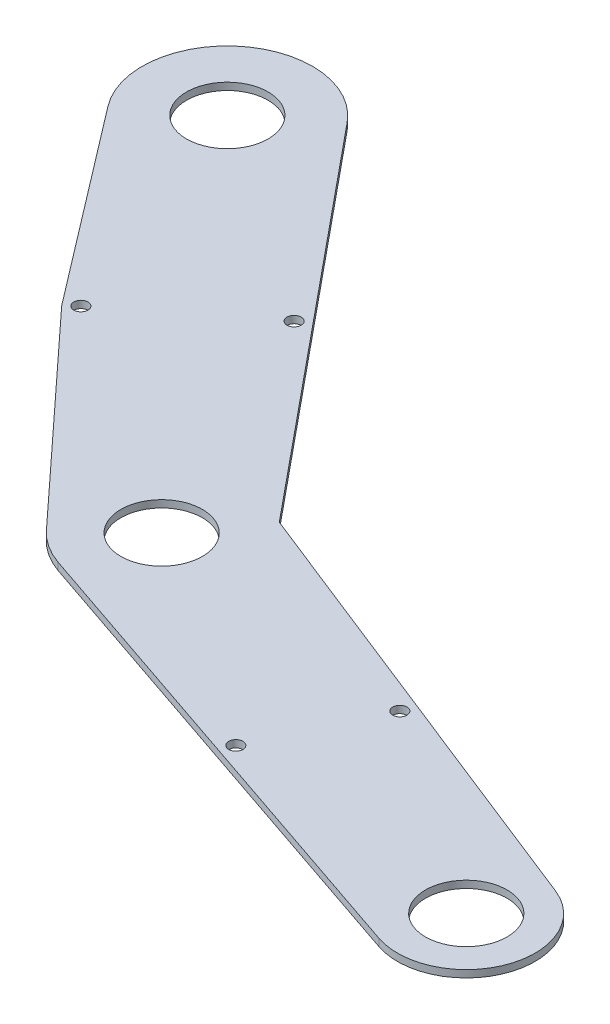
ISO-10303-21;
HEADER;
FILE_DESCRIPTION(('STEP AP214'),'2;1');
FILE_NAME('part.step','',(''),(''),'','','');
FILE_SCHEMA(('AUTOMOTIVE_DESIGN { 1 0 10303 214 1 1 1 1 }'));
ENDSEC;
DATA;
#1=APPLICATION_CONTEXT('core data for automotive mechanical design processes');
#2=APPLICATION_PROTOCOL_DEFINITION('international standard','automotive_design',2000,#1);
#3=PRODUCT_CONTEXT('',#1,'mechanical');
#4=PRODUCT('Part','Part','',(#3));
#5=PRODUCT_RELATED_PRODUCT_CATEGORY('part','',(#4));
#6=PRODUCT_DEFINITION_FORMATION('','',#4);
#7=PRODUCT_DEFINITION_CONTEXT('part definition',#1,'design');
#8=PRODUCT_DEFINITION('design','',#6,#7);
#9=PRODUCT_DEFINITION_SHAPE('','',#8);
#10=(LENGTH_UNIT() NAMED_UNIT(*) SI_UNIT(.MILLI.,.METRE.));
#11=(NAMED_UNIT(*) PLANE_ANGLE_UNIT() SI_UNIT($,.RADIAN.));
#12=(NAMED_UNIT(*) SI_UNIT($,.STERADIAN.) SOLID_ANGLE_UNIT());
#13=UNCERTAINTY_MEASURE_WITH_UNIT(LENGTH_MEASURE(1.E-05),#10,'distance_accuracy_value','');
#14=(GEOMETRIC_REPRESENTATION_CONTEXT(3) GLOBAL_UNCERTAINTY_ASSIGNED_CONTEXT((#13)) GLOBAL_UNIT_ASSIGNED_CONTEXT((#10,
#11,#12)) REPRESENTATION_CONTEXT('',''));
#15=CARTESIAN_POINT('',(0.,0.,0.));
#16=DIRECTION('',(0.,0.,1.));
#17=DIRECTION('',(1.,0.,0.));
#18=AXIS2_PLACEMENT_3D('',#15,#16,#17);
#19=CARTESIAN_POINT('',(120.65,2.54,-17.78));
#20=DIRECTION('',(0.,1.,0.));
#21=DIRECTION('',(0.,0.,1.));
#22=AXIS2_PLACEMENT_3D('',#19,#20,#21);
#23=PLANE('',#22);
#24=CARTESIAN_POINT('',(313.339024805222,2.54,171.940204958759));
#25=DIRECTION('',(0.,1.,0.));
#26=DIRECTION('',(0.,0.,1.));
#27=AXIS2_PLACEMENT_3D('',#24,#25,#26);
#28=CIRCLE('',#27,2.48919999999995);
#29=CARTESIAN_POINT('',(313.339024805222,2.54,174.429404958759));
#30=VERTEX_POINT('',#29);
#31=EDGE_CURVE('E466',#30,#30,#28,.T.);
#32=ORIENTED_EDGE('',*,*,#31,.F.);
#33=EDGE_LOOP('',(#32));
#34=FACE_BOUND('',#33,.T.);
#35=CARTESIAN_POINT('',(152.843335407897,2.54,65.7355734554761));
#36=DIRECTION('',(0.,1.,0.));
#37=DIRECTION('',(0.,0.,1.));
#38=AXIS2_PLACEMENT_3D('',#35,#36,#37);
#39=CIRCLE('',#38,2.4892);
#40=CARTESIAN_POINT('',(152.843335407897,2.54,68.2247734554761));
#41=VERTEX_POINT('',#40);
#42=EDGE_CURVE('E482',#41,#41,#39,.T.);
#43=ORIENTED_EDGE('',*,*,#42,.F.);
#44=EDGE_LOOP('',(#43));
#45=FACE_BOUND('',#44,.T.);
#46=CARTESIAN_POINT('',(120.65,2.54,-17.78));
#47=DIRECTION('',(0.,1.,0.));
#48=DIRECTION('',(0.,0.,1.));
#49=AXIS2_PLACEMENT_3D('',#46,#47,#48);
#50=CIRCLE('',#49,14.2875);
#51=CARTESIAN_POINT('',(120.65,2.54,-3.49249999999997));
#52=VERTEX_POINT('',#51);
#53=EDGE_CURVE('E498',#52,#52,#50,.T.);
#54=ORIENTED_EDGE('',*,*,#53,.F.);
#55=EDGE_LOOP('',(#54));
#56=FACE_BOUND('',#55,.T.);
#57=CARTESIAN_POINT('',(120.65,2.54,-17.78));
#58=DIRECTION('',(0.,1.,0.));
#59=DIRECTION('',(0.,0.,1.));
#60=AXIS2_PLACEMENT_3D('',#57,#58,#59);
#61=CIRCLE('',#60,29.845);
#62=CARTESIAN_POINT('',(143.710939325319,2.54,-36.7251076120971));
#63=VERTEX_POINT('',#62);
#64=CARTESIAN_POINT('',(96.9307860931418,2.54,0.334163426465615));
#65=VERTEX_POINT('',#64);
#66=EDGE_CURVE('E365',#63,#65,#61,.T.);
#67=ORIENTED_EDGE('',*,*,#66,.T.);
#68=DIRECTION('',(0.606941310988962,0.,0.794746654610764));
#69=VECTOR('',#68,1.);
#70=CARTESIAN_POINT('',(96.9307860931418,2.54,0.334163426465615));
#71=LINE('',#70,#69);
#72=CARTESIAN_POINT('',(149.346237710149,2.54,68.9684845186512));
#73=VERTEX_POINT('',#72);
#74=EDGE_CURVE('E291',#65,#73,#71,.T.);
#75=ORIENTED_EDGE('',*,*,#74,.T.);
#76=DIRECTION('',(-0.678826469957992,0.,-0.734298729186134));
#77=VECTOR('',#76,1.);
#78=CARTESIAN_POINT('',(214.866568590494,2.54,139.842997859697));
#79=LINE('',#78,#77);
#80=CARTESIAN_POINT('',(214.866568590494,2.54,139.842997859697));
#81=VERTEX_POINT('',#80);
#82=EDGE_CURVE('E383',#81,#73,#79,.T.);
#83=ORIENTED_EDGE('',*,*,#82,.F.);
#84=CARTESIAN_POINT('',(235.849154776988,2.54,120.445531480647));
#85=DIRECTION('',(0.,1.,0.));
#86=DIRECTION('',(0.,0.,1.));
#87=AXIS2_PLACEMENT_3D('',#84,#85,#86);
#88=CIRCLE('',#87,28.575);
#89=CARTESIAN_POINT('',(226.651670811032,2.54,147.499864104018));
#90=VERTEX_POINT('',#89);
#91=EDGE_CURVE('E395',#81,#90,#88,.T.);
#92=ORIENTED_EDGE('',*,*,#91,.T.);
#93=DIRECTION('',(-0.946783293906237,0.,-0.321871704845356));
#94=VECTOR('',#93,1.);
#95=CARTESIAN_POINT('',(396.96055081076,2.54,205.398656687957));
#96=LINE('',#95,#94);
#97=CARTESIAN_POINT('',(396.96055081076,2.54,205.398656687957));
#98=VERTEX_POINT('',#97);
#99=EDGE_CURVE('E314',#98,#90,#96,.T.);
#100=ORIENTED_EDGE('',*,*,#99,.F.);
#101=CARTESIAN_POINT('',(404.727315048678,2.54,182.552775805999));
#102=DIRECTION('',(0.,1.,0.));
#103=DIRECTION('',(0.,0.,1.));
#104=AXIS2_PLACEMENT_3D('',#101,#102,#103);
#105=CIRCLE('',#104,24.13);
#106=CARTESIAN_POINT('',(413.612986441963,2.54,160.118388275011));
#107=VERTEX_POINT('',#106);
#108=EDGE_CURVE('E307',#98,#107,#105,.T.);
#109=ORIENTED_EDGE('',*,*,#108,.T.);
#110=DIRECTION('',(-0.92973010903391,0.,-0.368241665697669));
#111=VECTOR('',#110,1.);
#112=CARTESIAN_POINT('',(413.612986441963,2.54,160.118388275011));
#113=LINE('',#112,#111);
#114=CARTESIAN_POINT('',(253.239610326479,2.54,96.5987081221433));
#115=VERTEX_POINT('',#114);
#116=EDGE_CURVE('E312',#107,#115,#113,.T.);
#117=ORIENTED_EDGE('',*,*,#116,.T.);
#118=DIRECTION('',(0.634783300790656,0.,0.772690210263673));
#119=VECTOR('',#118,1.);
#120=CARTESIAN_POINT('',(143.710939325319,2.54,-36.7251076120971));
#121=LINE('',#120,#119);
#122=EDGE_CURVE('E330',#63,#115,#121,.T.);
#123=ORIENTED_EDGE('',*,*,#122,.F.);
#124=EDGE_LOOP('',(#67,#75,#83,#92,#100,#109,#117,#123));
#125=FACE_BOUND('',#124,.T.);
#126=CARTESIAN_POINT('',(235.849154776988,2.54,120.445531480647));
#127=DIRECTION('',(0.,1.,0.));
#128=DIRECTION('',(0.,0.,1.));
#129=AXIS2_PLACEMENT_3D('',#126,#127,#128);
#130=CIRCLE('',#129,14.2875);
#131=CARTESIAN_POINT('',(235.849154776988,2.54,134.733031480647));
#132=VERTEX_POINT('',#131);
#133=EDGE_CURVE('E340',#132,#132,#130,.T.);
#134=ORIENTED_EDGE('',*,*,#133,.F.);
#135=EDGE_LOOP('',(#134));
#136=FACE_BOUND('',#135,.T.);
#137=CARTESIAN_POINT('',(194.795337699518,2.54,32.9599557250386));
#138=DIRECTION('',(0.,1.,0.));
#139=DIRECTION('',(0.,0.,1.));
#140=AXIS2_PLACEMENT_3D('',#137,#138,#139);
#141=CIRCLE('',#140,2.4892);
#142=CARTESIAN_POINT('',(194.795337699518,2.54,35.4491557250386));
#143=VERTEX_POINT('',#142);
#144=EDGE_CURVE('E490',#143,#143,#141,.T.);
#145=ORIENTED_EDGE('',*,*,#144,.F.);
#146=EDGE_LOOP('',(#145));
#147=FACE_BOUND('',#146,.T.);
#148=CARTESIAN_POINT('',(331.672547451336,2.54,132.786387842851));
#149=DIRECTION('',(0.,1.,0.));
#150=DIRECTION('',(0.,0.,1.));
#151=AXIS2_PLACEMENT_3D('',#148,#149,#150);
#152=CIRCLE('',#151,2.48919999999995);
#153=CARTESIAN_POINT('',(331.672547451336,2.54,135.275587842851));
#154=VERTEX_POINT('',#153);
#155=EDGE_CURVE('E474',#154,#154,#152,.T.);
#156=ORIENTED_EDGE('',*,*,#155,.F.);
#157=EDGE_LOOP('',(#156));
#158=FACE_BOUND('',#157,.T.);
#159=CARTESIAN_POINT('',(404.727315048678,2.54,182.552775805999));
#160=DIRECTION('',(0.,1.,0.));
#161=DIRECTION('',(0.,0.,1.));
#162=AXIS2_PLACEMENT_3D('',#159,#160,#161);
#163=CIRCLE('',#162,14.2875);
#164=CARTESIAN_POINT('',(404.727315048678,2.54,196.840275805999));
#165=VERTEX_POINT('',#164);
#166=EDGE_CURVE('E455',#165,#165,#163,.T.);
#167=ORIENTED_EDGE('',*,*,#166,.F.);
#168=EDGE_LOOP('',(#167));
#169=FACE_BOUND('',#168,.T.);
#170=ADVANCED_FACE('F234',(#34,#45,#56,#125,#136,#147,#158,#169),#23,.T.);
#171=CARTESIAN_POINT('',(120.65,0.,-17.78));
#172=DIRECTION('',(0.,1.,0.));
#173=DIRECTION('',(0.,0.,1.));
#174=AXIS2_PLACEMENT_3D('',#171,#172,#173);
#175=PLANE('',#174);
#176=CARTESIAN_POINT('',(120.65,0.,-17.78));
#177=DIRECTION('',(0.,1.,0.));
#178=DIRECTION('',(0.,0.,1.));
#179=AXIS2_PLACEMENT_3D('',#176,#177,#178);
#180=CIRCLE('',#179,29.845);
#181=CARTESIAN_POINT('',(143.710939325319,0.,-36.7251076120971));
#182=VERTEX_POINT('',#181);
#183=CARTESIAN_POINT('',(96.9307860931418,0.,0.334163426465615));
#184=VERTEX_POINT('',#183);
#185=EDGE_CURVE('E336',#182,#184,#180,.T.);
#186=ORIENTED_EDGE('',*,*,#185,.F.);
#187=DIRECTION('',(0.634783300790656,0.,0.772690210263673));
#188=VECTOR('',#187,1.);
#189=CARTESIAN_POINT('',(143.710939325319,0.,-36.7251076120971));
#190=LINE('',#189,#188);
#191=CARTESIAN_POINT('',(253.239610326479,0.,96.5987081221433));
#192=VERTEX_POINT('',#191);
#193=EDGE_CURVE('E361',#182,#192,#190,.T.);
#194=ORIENTED_EDGE('',*,*,#193,.T.);
#195=DIRECTION('',(-0.92973010903391,0.,-0.368241665697669));
#196=VECTOR('',#195,1.);
#197=CARTESIAN_POINT('',(413.612986441963,0.,160.118388275011));
#198=LINE('',#197,#196);
#199=CARTESIAN_POINT('',(413.612986441963,0.,160.118388275011));
#200=VERTEX_POINT('',#199);
#201=EDGE_CURVE('E358',#200,#192,#198,.T.);
#202=ORIENTED_EDGE('',*,*,#201,.F.);
#203=CARTESIAN_POINT('',(404.727315048678,0.,182.552775805999));
#204=DIRECTION('',(0.,1.,0.));
#205=DIRECTION('',(0.,0.,1.));
#206=AXIS2_PLACEMENT_3D('',#203,#204,#205);
#207=CIRCLE('',#206,24.13);
#208=CARTESIAN_POINT('',(396.96055081076,0.,205.398656687957));
#209=VERTEX_POINT('',#208);
#210=EDGE_CURVE('E322',#209,#200,#207,.T.);
#211=ORIENTED_EDGE('',*,*,#210,.F.);
#212=DIRECTION('',(-0.946783293906237,0.,-0.321871704845356));
#213=VECTOR('',#212,1.);
#214=CARTESIAN_POINT('',(396.96055081076,0.,205.398656687957));
#215=LINE('',#214,#213);
#216=CARTESIAN_POINT('',(226.651670811032,0.,147.499864104018));
#217=VERTEX_POINT('',#216);
#218=EDGE_CURVE('E352',#209,#217,#215,.T.);
#219=ORIENTED_EDGE('',*,*,#218,.T.);
#220=CARTESIAN_POINT('',(235.849154776988,0.,120.445531480647));
#221=DIRECTION('',(0.,1.,0.));
#222=DIRECTION('',(0.,0.,1.));
#223=AXIS2_PLACEMENT_3D('',#220,#221,#222);
#224=CIRCLE('',#223,28.575);
#225=CARTESIAN_POINT('',(214.866568590494,0.,139.842997859697));
#226=VERTEX_POINT('',#225);
#227=EDGE_CURVE('E348',#226,#217,#224,.T.);
#228=ORIENTED_EDGE('',*,*,#227,.F.);
#229=DIRECTION('',(-0.678826469957992,0.,-0.734298729186134));
#230=VECTOR('',#229,1.);
#231=CARTESIAN_POINT('',(214.866568590494,0.,139.842997859697));
#232=LINE('',#231,#230);
#233=CARTESIAN_POINT('',(149.346237710149,0.,68.9684845186512));
#234=VERTEX_POINT('',#233);
#235=EDGE_CURVE('E344',#226,#234,#232,.T.);
#236=ORIENTED_EDGE('',*,*,#235,.T.);
#237=DIRECTION('',(0.606941310988962,0.,0.794746654610764));
#238=VECTOR('',#237,1.);
#239=CARTESIAN_POINT('',(96.9307860931418,0.,0.334163426465615));
#240=LINE('',#239,#238);
#241=EDGE_CURVE('E339',#184,#234,#240,.T.);
#242=ORIENTED_EDGE('',*,*,#241,.F.);
#243=EDGE_LOOP('',(#186,#194,#202,#211,#219,#228,#236,#242));
#244=FACE_BOUND('',#243,.T.);
#245=CARTESIAN_POINT('',(235.849154776988,0.,120.445531480647));
#246=DIRECTION('',(0.,1.,0.));
#247=DIRECTION('',(0.,0.,1.));
#248=AXIS2_PLACEMENT_3D('',#245,#246,#247);
#249=CIRCLE('',#248,14.2875);
#250=CARTESIAN_POINT('',(235.849154776988,0.,134.733031480647));
#251=VERTEX_POINT('',#250);
#252=EDGE_CURVE('E502',#251,#251,#249,.T.);
#253=ORIENTED_EDGE('',*,*,#252,.T.);
#254=EDGE_LOOP('',(#253));
#255=FACE_BOUND('',#254,.T.);
#256=CARTESIAN_POINT('',(120.65,0.,-17.78));
#257=DIRECTION('',(0.,1.,0.));
#258=DIRECTION('',(0.,0.,1.));
#259=AXIS2_PLACEMENT_3D('',#256,#257,#258);
#260=CIRCLE('',#259,14.2875);
#261=CARTESIAN_POINT('',(120.65,0.,-3.49249999999997));
#262=VERTEX_POINT('',#261);
#263=EDGE_CURVE('E494',#262,#262,#260,.T.);
#264=ORIENTED_EDGE('',*,*,#263,.T.);
#265=EDGE_LOOP('',(#264));
#266=FACE_BOUND('',#265,.T.);
#267=CARTESIAN_POINT('',(194.795337699518,0.,32.9599557250386));
#268=DIRECTION('',(0.,1.,0.));
#269=DIRECTION('',(0.,0.,1.));
#270=AXIS2_PLACEMENT_3D('',#267,#268,#269);
#271=CIRCLE('',#270,2.4892);
#272=CARTESIAN_POINT('',(194.795337699518,0.,35.4491557250386));
#273=VERTEX_POINT('',#272);
#274=EDGE_CURVE('E486',#273,#273,#271,.T.);
#275=ORIENTED_EDGE('',*,*,#274,.T.);
#276=EDGE_LOOP('',(#275));
#277=FACE_BOUND('',#276,.T.);
#278=CARTESIAN_POINT('',(152.843335407897,0.,65.7355734554761));
#279=DIRECTION('',(0.,1.,0.));
#280=DIRECTION('',(0.,0.,1.));
#281=AXIS2_PLACEMENT_3D('',#278,#279,#280);
#282=CIRCLE('',#281,2.4892);
#283=CARTESIAN_POINT('',(152.843335407897,0.,68.2247734554761));
#284=VERTEX_POINT('',#283);
#285=EDGE_CURVE('E478',#284,#284,#282,.T.);
#286=ORIENTED_EDGE('',*,*,#285,.T.);
#287=EDGE_LOOP('',(#286));
#288=FACE_BOUND('',#287,.T.);
#289=CARTESIAN_POINT('',(331.672547451336,0.,132.786387842851));
#290=DIRECTION('',(0.,1.,0.));
#291=DIRECTION('',(0.,0.,1.));
#292=AXIS2_PLACEMENT_3D('',#289,#290,#291);
#293=CIRCLE('',#292,2.48919999999995);
#294=CARTESIAN_POINT('',(331.672547451336,0.,135.275587842851));
#295=VERTEX_POINT('',#294);
#296=EDGE_CURVE('E470',#295,#295,#293,.T.);
#297=ORIENTED_EDGE('',*,*,#296,.T.);
#298=EDGE_LOOP('',(#297));
#299=FACE_BOUND('',#298,.T.);
#300=CARTESIAN_POINT('',(313.339024805222,0.,171.940204958759));
#301=DIRECTION('',(0.,1.,0.));
#302=DIRECTION('',(0.,0.,1.));
#303=AXIS2_PLACEMENT_3D('',#300,#301,#302);
#304=CIRCLE('',#303,2.48919999999995);
#305=CARTESIAN_POINT('',(313.339024805222,0.,174.429404958759));
#306=VERTEX_POINT('',#305);
#307=EDGE_CURVE('E463',#306,#306,#304,.T.);
#308=ORIENTED_EDGE('',*,*,#307,.T.);
#309=EDGE_LOOP('',(#308));
#310=FACE_BOUND('',#309,.T.);
#311=CARTESIAN_POINT('',(404.727315048678,0.,182.552775805999));
#312=DIRECTION('',(0.,1.,0.));
#313=DIRECTION('',(0.,0.,1.));
#314=AXIS2_PLACEMENT_3D('',#311,#312,#313);
#315=CIRCLE('',#314,14.2875);
#316=CARTESIAN_POINT('',(404.727315048678,0.,196.840275805999));
#317=VERTEX_POINT('',#316);
#318=EDGE_CURVE('E458',#317,#317,#315,.T.);
#319=ORIENTED_EDGE('',*,*,#318,.T.);
#320=EDGE_LOOP('',(#319));
#321=FACE_BOUND('',#320,.T.);
#322=ADVANCED_FACE('F388',(#244,#255,#266,#277,#288,#299,#310,#321),#175,.F.);
#323=CARTESIAN_POINT('',(120.65,2.54,-17.78));
#324=DIRECTION('',(0.,-1.,0.));
#325=DIRECTION('',(0.,0.,-1.));
#326=AXIS2_PLACEMENT_3D('',#323,#324,#325);
#327=CYLINDRICAL_SURFACE('',#326,29.845);
#328=ORIENTED_EDGE('',*,*,#185,.T.);
#329=DIRECTION('',(0.,-1.,0.));
#330=VECTOR('',#329,1.);
#331=CARTESIAN_POINT('',(96.9307860931418,2.54,0.334163426465615));
#332=LINE('',#331,#330);
#333=EDGE_CURVE('E12',#65,#184,#332,.T.);
#334=ORIENTED_EDGE('',*,*,#333,.F.);
#335=ORIENTED_EDGE('',*,*,#66,.F.);
#336=DIRECTION('',(0.,-1.,0.));
#337=VECTOR('',#336,1.);
#338=CARTESIAN_POINT('',(143.710939325319,2.54,-36.7251076120971));
#339=LINE('',#338,#337);
#340=EDGE_CURVE('E252',#63,#182,#339,.T.);
#341=ORIENTED_EDGE('',*,*,#340,.T.);
#342=EDGE_LOOP('',(#328,#334,#335,#341));
#343=FACE_BOUND('',#342,.T.);
#344=ADVANCED_FACE('F236',(#343),#327,.T.);
#345=CARTESIAN_POINT('',(96.9307860931418,2.54,0.334163426465615));
#346=DIRECTION('',(0.794746654610764,0.,-0.606941310988962));
#347=DIRECTION('',(-0.606941310988962,0.,-0.794746654610764));
#348=AXIS2_PLACEMENT_3D('',#345,#346,#347);
#349=PLANE('',#348);
#350=ORIENTED_EDGE('',*,*,#241,.T.);
#351=DIRECTION('',(0.,-1.,0.));
#352=VECTOR('',#351,1.);
#353=CARTESIAN_POINT('',(149.346237710149,2.54,68.9684845186512));
#354=LINE('',#353,#352);
#355=EDGE_CURVE('E244',#73,#234,#354,.T.);
#356=ORIENTED_EDGE('',*,*,#355,.F.);
#357=ORIENTED_EDGE('',*,*,#74,.F.);
#358=ORIENTED_EDGE('',*,*,#333,.T.);
#359=EDGE_LOOP('',(#350,#356,#357,#358));
#360=FACE_BOUND('',#359,.T.);
#361=ADVANCED_FACE('F384',(#360),#349,.F.);
#362=CARTESIAN_POINT('',(214.866568590494,2.54,139.842997859697));
#363=DIRECTION('',(-0.734298729186134,0.,0.678826469957992));
#364=DIRECTION('',(0.678826469957992,0.,0.734298729186134));
#365=AXIS2_PLACEMENT_3D('',#362,#363,#364);
#366=PLANE('',#365);
#367=ORIENTED_EDGE('',*,*,#235,.F.);
#368=DIRECTION('',(0.,-1.,0.));
#369=VECTOR('',#368,1.);
#370=CARTESIAN_POINT('',(214.866568590494,2.54,139.842997859697));
#371=LINE('',#370,#369);
#372=EDGE_CURVE('E375',#81,#226,#371,.T.);
#373=ORIENTED_EDGE('',*,*,#372,.F.);
#374=ORIENTED_EDGE('',*,*,#82,.T.);
#375=ORIENTED_EDGE('',*,*,#355,.T.);
#376=EDGE_LOOP('',(#367,#373,#374,#375));
#377=FACE_BOUND('',#376,.T.);
#378=ADVANCED_FACE('F381',(#377),#366,.T.);
#379=CARTESIAN_POINT('',(235.849154776988,2.54,120.445531480647));
#380=DIRECTION('',(0.,-1.,0.));
#381=DIRECTION('',(0.,0.,-1.));
#382=AXIS2_PLACEMENT_3D('',#379,#380,#381);
#383=CYLINDRICAL_SURFACE('',#382,28.575);
#384=ORIENTED_EDGE('',*,*,#227,.T.);
#385=DIRECTION('',(0.,-1.,0.));
#386=VECTOR('',#385,1.);
#387=CARTESIAN_POINT('',(226.651670811032,2.54,147.499864104018));
#388=LINE('',#387,#386);
#389=EDGE_CURVE('E372',#90,#217,#388,.T.);
#390=ORIENTED_EDGE('',*,*,#389,.F.);
#391=ORIENTED_EDGE('',*,*,#91,.F.);
#392=ORIENTED_EDGE('',*,*,#372,.T.);
#393=EDGE_LOOP('',(#384,#390,#391,#392));
#394=FACE_BOUND('',#393,.T.);
#395=ADVANCED_FACE('F393',(#394),#383,.T.);
#396=CARTESIAN_POINT('',(396.96055081076,2.54,205.398656687957));
#397=DIRECTION('',(-0.321871704845356,0.,0.946783293906237));
#398=DIRECTION('',(0.946783293906237,0.,0.321871704845356));
#399=AXIS2_PLACEMENT_3D('',#396,#397,#398);
#400=PLANE('',#399);
#401=ORIENTED_EDGE('',*,*,#218,.F.);
#402=DIRECTION('',(0.,-1.,0.));
#403=VECTOR('',#402,1.);
#404=CARTESIAN_POINT('',(396.96055081076,2.54,205.398656687957));
#405=LINE('',#404,#403);
#406=EDGE_CURVE('E326',#98,#209,#405,.T.);
#407=ORIENTED_EDGE('',*,*,#406,.F.);
#408=ORIENTED_EDGE('',*,*,#99,.T.);
#409=ORIENTED_EDGE('',*,*,#389,.T.);
#410=EDGE_LOOP('',(#401,#407,#408,#409));
#411=FACE_BOUND('',#410,.T.);
#412=ADVANCED_FACE('F405',(#411),#400,.T.);
#413=CARTESIAN_POINT('',(404.727315048678,2.54,182.552775805999));
#414=DIRECTION('',(0.,-1.,0.));
#415=DIRECTION('',(0.,0.,-1.));
#416=AXIS2_PLACEMENT_3D('',#413,#414,#415);
#417=CYLINDRICAL_SURFACE('',#416,24.13);
#418=ORIENTED_EDGE('',*,*,#210,.T.);
#419=DIRECTION('',(0.,-1.,0.));
#420=VECTOR('',#419,1.);
#421=CARTESIAN_POINT('',(413.612986441963,2.54,160.118388275011));
#422=LINE('',#421,#420);
#423=EDGE_CURVE('E319',#107,#200,#422,.T.);
#424=ORIENTED_EDGE('',*,*,#423,.F.);
#425=ORIENTED_EDGE('',*,*,#108,.F.);
#426=ORIENTED_EDGE('',*,*,#406,.T.);
#427=EDGE_LOOP('',(#418,#424,#425,#426));
#428=FACE_BOUND('',#427,.T.);
#429=ADVANCED_FACE('F320',(#428),#417,.T.);
#430=CARTESIAN_POINT('',(413.612986441963,2.54,160.118388275011));
#431=DIRECTION('',(-0.368241665697669,0.,0.92973010903391));
#432=DIRECTION('',(0.92973010903391,0.,0.368241665697669));
#433=AXIS2_PLACEMENT_3D('',#430,#431,#432);
#434=PLANE('',#433);
#435=ORIENTED_EDGE('',*,*,#201,.T.);
#436=DIRECTION('',(0.,-1.,0.));
#437=VECTOR('',#436,1.);
#438=CARTESIAN_POINT('',(253.239610326479,2.54,96.5987081221433));
#439=LINE('',#438,#437);
#440=EDGE_CURVE('E279',#115,#192,#439,.T.);
#441=ORIENTED_EDGE('',*,*,#440,.F.);
#442=ORIENTED_EDGE('',*,*,#116,.F.);
#443=ORIENTED_EDGE('',*,*,#423,.T.);
#444=EDGE_LOOP('',(#435,#441,#442,#443));
#445=FACE_BOUND('',#444,.T.);
#446=ADVANCED_FACE('F328',(#445),#434,.F.);
#447=CARTESIAN_POINT('',(143.710939325319,2.54,-36.7251076120971));
#448=DIRECTION('',(0.772690210263673,0.,-0.634783300790656));
#449=DIRECTION('',(-0.634783300790657,0.,-0.772690210263673));
#450=AXIS2_PLACEMENT_3D('',#447,#448,#449);
#451=PLANE('',#450);
#452=ORIENTED_EDGE('',*,*,#193,.F.);
#453=ORIENTED_EDGE('',*,*,#340,.F.);
#454=ORIENTED_EDGE('',*,*,#122,.T.);
#455=ORIENTED_EDGE('',*,*,#440,.T.);
#456=EDGE_LOOP('',(#452,#453,#454,#455));
#457=FACE_BOUND('',#456,.T.);
#458=ADVANCED_FACE('F406',(#457),#451,.T.);
#459=CARTESIAN_POINT('',(235.849154776988,2.54,120.445531480647));
#460=DIRECTION('',(0.,-1.,0.));
#461=DIRECTION('',(0.,0.,-1.));
#462=AXIS2_PLACEMENT_3D('',#459,#460,#461);
#463=CYLINDRICAL_SURFACE('',#462,14.2875);
#464=ORIENTED_EDGE('',*,*,#133,.T.);
#465=EDGE_LOOP('',(#464));
#466=FACE_BOUND('',#465,.T.);
#467=ORIENTED_EDGE('',*,*,#252,.F.);
#468=EDGE_LOOP('',(#467));
#469=FACE_BOUND('',#468,.T.);
#470=ADVANCED_FACE('F408',(#466,#469),#463,.F.);
#471=CARTESIAN_POINT('',(120.65,2.54,-17.78));
#472=DIRECTION('',(0.,-1.,0.));
#473=DIRECTION('',(0.,0.,-1.));
#474=AXIS2_PLACEMENT_3D('',#471,#472,#473);
#475=CYLINDRICAL_SURFACE('',#474,14.2875);
#476=ORIENTED_EDGE('',*,*,#53,.T.);
#477=EDGE_LOOP('',(#476));
#478=FACE_BOUND('',#477,.T.);
#479=ORIENTED_EDGE('',*,*,#263,.F.);
#480=EDGE_LOOP('',(#479));
#481=FACE_BOUND('',#480,.T.);
#482=ADVANCED_FACE('F414',(#478,#481),#475,.F.);
#483=CARTESIAN_POINT('',(194.795337699518,2.54,32.9599557250386));
#484=DIRECTION('',(0.,-1.,0.));
#485=DIRECTION('',(0.,0.,-1.));
#486=AXIS2_PLACEMENT_3D('',#483,#484,#485);
#487=CYLINDRICAL_SURFACE('',#486,2.4892);
#488=ORIENTED_EDGE('',*,*,#144,.T.);
#489=EDGE_LOOP('',(#488));
#490=FACE_BOUND('',#489,.T.);
#491=ORIENTED_EDGE('',*,*,#274,.F.);
#492=EDGE_LOOP('',(#491));
#493=FACE_BOUND('',#492,.T.);
#494=ADVANCED_FACE('F430',(#490,#493),#487,.F.);
#495=CARTESIAN_POINT('',(152.843335407897,2.54,65.7355734554761));
#496=DIRECTION('',(0.,-1.,0.));
#497=DIRECTION('',(0.,0.,-1.));
#498=AXIS2_PLACEMENT_3D('',#495,#496,#497);
#499=CYLINDRICAL_SURFACE('',#498,2.4892);
#500=ORIENTED_EDGE('',*,*,#42,.T.);
#501=EDGE_LOOP('',(#500));
#502=FACE_BOUND('',#501,.T.);
#503=ORIENTED_EDGE('',*,*,#285,.F.);
#504=EDGE_LOOP('',(#503));
#505=FACE_BOUND('',#504,.T.);
#506=ADVANCED_FACE('F434',(#502,#505),#499,.F.);
#507=CARTESIAN_POINT('',(331.672547451336,2.54,132.786387842851));
#508=DIRECTION('',(0.,-1.,0.));
#509=DIRECTION('',(0.,0.,-1.));
#510=AXIS2_PLACEMENT_3D('',#507,#508,#509);
#511=CYLINDRICAL_SURFACE('',#510,2.48919999999995);
#512=ORIENTED_EDGE('',*,*,#155,.T.);
#513=EDGE_LOOP('',(#512));
#514=FACE_BOUND('',#513,.T.);
#515=ORIENTED_EDGE('',*,*,#296,.F.);
#516=EDGE_LOOP('',(#515));
#517=FACE_BOUND('',#516,.T.);
#518=ADVANCED_FACE('F438',(#514,#517),#511,.F.);
#519=CARTESIAN_POINT('',(313.339024805222,2.54,171.940204958759));
#520=DIRECTION('',(0.,-1.,0.));
#521=DIRECTION('',(0.,0.,-1.));
#522=AXIS2_PLACEMENT_3D('',#519,#520,#521);
#523=CYLINDRICAL_SURFACE('',#522,2.48919999999995);
#524=ORIENTED_EDGE('',*,*,#31,.T.);
#525=EDGE_LOOP('',(#524));
#526=FACE_BOUND('',#525,.T.);
#527=ORIENTED_EDGE('',*,*,#307,.F.);
#528=EDGE_LOOP('',(#527));
#529=FACE_BOUND('',#528,.T.);
#530=ADVANCED_FACE('F442',(#526,#529),#523,.F.);
#531=CARTESIAN_POINT('',(404.727315048678,2.54,182.552775805999));
#532=DIRECTION('',(0.,-1.,0.));
#533=DIRECTION('',(0.,0.,-1.));
#534=AXIS2_PLACEMENT_3D('',#531,#532,#533);
#535=CYLINDRICAL_SURFACE('',#534,14.2875);
#536=ORIENTED_EDGE('',*,*,#166,.T.);
#537=EDGE_LOOP('',(#536));
#538=FACE_BOUND('',#537,.T.);
#539=ORIENTED_EDGE('',*,*,#318,.F.);
#540=EDGE_LOOP('',(#539));
#541=FACE_BOUND('',#540,.T.);
#542=ADVANCED_FACE('F446',(#538,#541),#535,.F.);
#543=CLOSED_SHELL('',(#170,#322,#344,#361,#378,#395,#412,#429,#446,#458,#470,#482,#494,#506,
#518,#530,#542));
#544=MANIFOLD_SOLID_BREP('B2',#543);
#545=ADVANCED_BREP_SHAPE_REPRESENTATION('',(#18,#544),#14);
#546=SHAPE_DEFINITION_REPRESENTATION(#9,#545);
ENDSEC;
END-ISO-10303-21;
